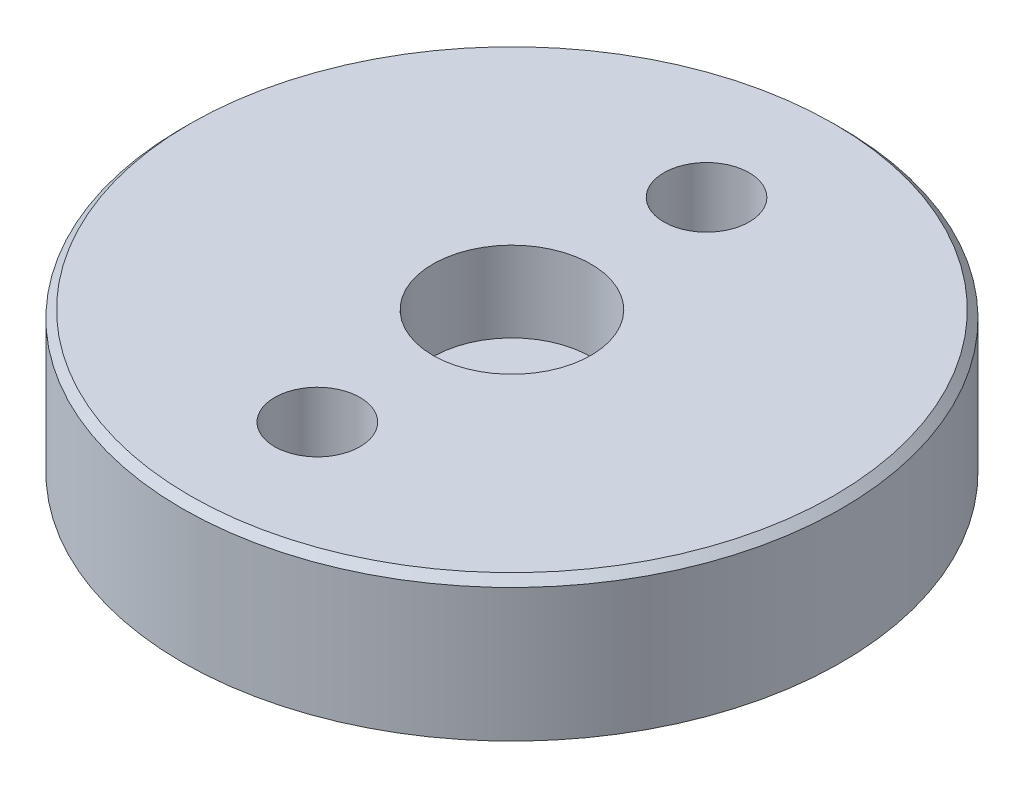
ISO-10303-21;
HEADER;
FILE_DESCRIPTION(('STEP AP214'),'2;1');
FILE_NAME('part.step','',(''),(''),'','','');
FILE_SCHEMA(('AUTOMOTIVE_DESIGN { 1 0 10303 214 1 1 1 1 }'));
ENDSEC;
DATA;
#1=APPLICATION_CONTEXT('core data for automotive mechanical design processes');
#2=APPLICATION_PROTOCOL_DEFINITION('international standard','automotive_design',2000,#1);
#3=PRODUCT_CONTEXT('',#1,'mechanical');
#4=PRODUCT('Part','Part','',(#3));
#5=PRODUCT_RELATED_PRODUCT_CATEGORY('part','',(#4));
#6=PRODUCT_DEFINITION_FORMATION('','',#4);
#7=PRODUCT_DEFINITION_CONTEXT('part definition',#1,'design');
#8=PRODUCT_DEFINITION('design','',#6,#7);
#9=PRODUCT_DEFINITION_SHAPE('','',#8);
#10=(LENGTH_UNIT() NAMED_UNIT(*) SI_UNIT(.MILLI.,.METRE.));
#11=(NAMED_UNIT(*) PLANE_ANGLE_UNIT() SI_UNIT($,.RADIAN.));
#12=(NAMED_UNIT(*) SI_UNIT($,.STERADIAN.) SOLID_ANGLE_UNIT());
#13=UNCERTAINTY_MEASURE_WITH_UNIT(LENGTH_MEASURE(1.E-05),#10,'distance_accuracy_value','');
#14=(GEOMETRIC_REPRESENTATION_CONTEXT(3) GLOBAL_UNCERTAINTY_ASSIGNED_CONTEXT((#13)) GLOBAL_UNIT_ASSIGNED_CONTEXT((#10,
#11,#12)) REPRESENTATION_CONTEXT('',''));
#15=CARTESIAN_POINT('',(0.,0.,0.));
#16=DIRECTION('',(0.,0.,1.));
#17=DIRECTION('',(1.,0.,0.));
#18=AXIS2_PLACEMENT_3D('',#15,#16,#17);
#19=CARTESIAN_POINT('',(0.,-468.875483874394,0.));
#20=DIRECTION('',(0.,1.,0.));
#21=DIRECTION('',(0.,0.,1.));
#22=AXIS2_PLACEMENT_3D('',#19,#20,#21);
#23=CYLINDRICAL_SURFACE('',#22,13.125);
#24=CARTESIAN_POINT('',(0.,-463.575483874394,0.));
#25=DIRECTION('',(0.,1.,0.));
#26=DIRECTION('',(0.,0.,1.));
#27=AXIS2_PLACEMENT_3D('',#24,#25,#26);
#28=CIRCLE('',#27,13.125);
#29=CARTESIAN_POINT('',(0.,-463.575483874394,13.125));
#30=VERTEX_POINT('',#29);
#31=EDGE_CURVE('E10',#30,#30,#28,.F.);
#32=ORIENTED_EDGE('',*,*,#31,.T.);
#33=EDGE_LOOP('',(#32));
#34=FACE_BOUND('',#33,.T.);
#35=CARTESIAN_POINT('',(0.,-468.875483874394,0.));
#36=DIRECTION('',(0.,1.,0.));
#37=DIRECTION('',(0.,0.,1.));
#38=AXIS2_PLACEMENT_3D('',#35,#36,#37);
#39=CIRCLE('',#38,13.125);
#40=CARTESIAN_POINT('',(0.,-468.875483874394,13.125));
#41=VERTEX_POINT('',#40);
#42=EDGE_CURVE('E53',#41,#41,#39,.T.);
#43=ORIENTED_EDGE('',*,*,#42,.T.);
#44=EDGE_LOOP('',(#43));
#45=FACE_BOUND('',#44,.T.);
#46=ADVANCED_FACE('F39',(#34,#45),#23,.T.);
#47=CARTESIAN_POINT('',(0.,-468.875483874394,0.));
#48=DIRECTION('',(0.,1.,0.));
#49=DIRECTION('',(0.,0.,1.));
#50=AXIS2_PLACEMENT_3D('',#47,#48,#49);
#51=PLANE('',#50);
#52=CARTESIAN_POINT('',(0.,-468.875483874394,0.));
#53=DIRECTION('',(0.,-1.,0.));
#54=DIRECTION('',(0.,0.,-1.));
#55=AXIS2_PLACEMENT_3D('',#52,#53,#54);
#56=CIRCLE('',#55,11.125);
#57=CARTESIAN_POINT('',(0.,-468.875483874394,-11.125));
#58=VERTEX_POINT('',#57);
#59=EDGE_CURVE('E74',#58,#58,#56,.T.);
#60=ORIENTED_EDGE('',*,*,#59,.F.);
#61=EDGE_LOOP('',(#60));
#62=FACE_BOUND('',#61,.T.);
#63=ORIENTED_EDGE('',*,*,#42,.F.);
#64=EDGE_LOOP('',(#63));
#65=FACE_BOUND('',#64,.T.);
#66=ADVANCED_FACE('F85',(#62,#65),#51,.F.);
#67=CARTESIAN_POINT('',(0.,-463.275483874394,0.));
#68=DIRECTION('',(0.,1.,0.));
#69=DIRECTION('',(0.,0.,1.));
#70=AXIS2_PLACEMENT_3D('',#67,#68,#69);
#71=PLANE('',#70);
#72=CARTESIAN_POINT('',(0.,-463.275483874394,7.75));
#73=DIRECTION('',(0.,1.,0.));
#74=DIRECTION('',(0.,0.,1.));
#75=AXIS2_PLACEMENT_3D('',#72,#73,#74);
#76=CIRCLE('',#75,1.7);
#77=CARTESIAN_POINT('',(0.,-463.275483874394,9.45));
#78=VERTEX_POINT('',#77);
#79=EDGE_CURVE('E58',#78,#78,#76,.T.);
#80=ORIENTED_EDGE('',*,*,#79,.F.);
#81=EDGE_LOOP('',(#80));
#82=FACE_BOUND('',#81,.T.);
#83=CARTESIAN_POINT('',(0.,-463.275483874394,-7.75));
#84=DIRECTION('',(0.,1.,0.));
#85=DIRECTION('',(0.,0.,-1.));
#86=AXIS2_PLACEMENT_3D('',#83,#84,#85);
#87=CIRCLE('',#86,1.7);
#88=CARTESIAN_POINT('',(0.,-463.275483874394,-6.05));
#89=VERTEX_POINT('',#88);
#90=EDGE_CURVE('E64',#89,#89,#87,.T.);
#91=ORIENTED_EDGE('',*,*,#90,.F.);
#92=EDGE_LOOP('',(#91));
#93=FACE_BOUND('',#92,.T.);
#94=CARTESIAN_POINT('',(0.,-463.275483874394,0.));
#95=DIRECTION('',(0.,1.,0.));
#96=DIRECTION('',(0.,0.,1.));
#97=AXIS2_PLACEMENT_3D('',#94,#95,#96);
#98=CIRCLE('',#97,12.825);
#99=CARTESIAN_POINT('',(0.,-463.275483874394,12.825));
#100=VERTEX_POINT('',#99);
#101=EDGE_CURVE('E48',#100,#100,#98,.T.);
#102=ORIENTED_EDGE('',*,*,#101,.T.);
#103=EDGE_LOOP('',(#102));
#104=FACE_BOUND('',#103,.T.);
#105=CARTESIAN_POINT('',(0.,-463.275483874394,0.));
#106=DIRECTION('',(0.,1.,0.));
#107=DIRECTION('',(0.,0.,1.));
#108=AXIS2_PLACEMENT_3D('',#105,#106,#107);
#109=CIRCLE('',#108,3.15);
#110=CARTESIAN_POINT('',(0.,-463.275483874394,3.15));
#111=VERTEX_POINT('',#110);
#112=EDGE_CURVE('E62',#111,#111,#109,.T.);
#113=ORIENTED_EDGE('',*,*,#112,.F.);
#114=EDGE_LOOP('',(#113));
#115=FACE_BOUND('',#114,.T.);
#116=ADVANCED_FACE('F87',(#82,#93,#104,#115),#71,.T.);
#117=CARTESIAN_POINT('',(0.,-467.875483874394,0.));
#118=DIRECTION('',(0.,-1.,0.));
#119=DIRECTION('',(0.,0.,-1.));
#120=AXIS2_PLACEMENT_3D('',#117,#118,#119);
#121=CYLINDRICAL_SURFACE('',#120,11.125);
#122=CARTESIAN_POINT('',(0.,-467.875483874394,0.));
#123=DIRECTION('',(0.,-1.,0.));
#124=DIRECTION('',(0.,0.,-1.));
#125=AXIS2_PLACEMENT_3D('',#122,#123,#124);
#126=CIRCLE('',#125,11.125);
#127=CARTESIAN_POINT('',(0.,-467.875483874394,-11.125));
#128=VERTEX_POINT('',#127);
#129=EDGE_CURVE('E77',#128,#128,#126,.T.);
#130=ORIENTED_EDGE('',*,*,#129,.F.);
#131=EDGE_LOOP('',(#130));
#132=FACE_BOUND('',#131,.T.);
#133=ORIENTED_EDGE('',*,*,#59,.T.);
#134=EDGE_LOOP('',(#133));
#135=FACE_BOUND('',#134,.T.);
#136=ADVANCED_FACE('F94',(#132,#135),#121,.F.);
#137=CARTESIAN_POINT('',(0.,-467.875483874394,0.));
#138=DIRECTION('',(0.,-1.,0.));
#139=DIRECTION('',(0.,0.,-1.));
#140=AXIS2_PLACEMENT_3D('',#137,#138,#139);
#141=PLANE('',#140);
#142=CARTESIAN_POINT('',(0.,-467.875483874394,7.75));
#143=DIRECTION('',(0.,-1.,0.));
#144=DIRECTION('',(0.,0.,-1.));
#145=AXIS2_PLACEMENT_3D('',#142,#143,#144);
#146=CIRCLE('',#145,1.7);
#147=CARTESIAN_POINT('',(0.,-467.875483874394,9.45));
#148=VERTEX_POINT('',#147);
#149=EDGE_CURVE('E44',#148,#148,#146,.T.);
#150=ORIENTED_EDGE('',*,*,#149,.F.);
#151=EDGE_LOOP('',(#150));
#152=FACE_BOUND('',#151,.T.);
#153=CARTESIAN_POINT('',(0.,-467.875483874394,-7.75));
#154=DIRECTION('',(0.,-1.,0.));
#155=DIRECTION('',(0.,0.,-1.));
#156=AXIS2_PLACEMENT_3D('',#153,#154,#155);
#157=CIRCLE('',#156,1.7);
#158=CARTESIAN_POINT('',(0.,-467.875483874394,-6.05));
#159=VERTEX_POINT('',#158);
#160=EDGE_CURVE('E56',#159,#159,#157,.T.);
#161=ORIENTED_EDGE('',*,*,#160,.F.);
#162=EDGE_LOOP('',(#161));
#163=FACE_BOUND('',#162,.T.);
#164=ORIENTED_EDGE('',*,*,#129,.T.);
#165=EDGE_LOOP('',(#164));
#166=FACE_BOUND('',#165,.T.);
#167=ADVANCED_FACE('F101',(#152,#163,#166),#141,.T.);
#168=CARTESIAN_POINT('',(0.,-466.475483874394,0.));
#169=DIRECTION('',(0.,1.,0.));
#170=DIRECTION('',(0.,0.,1.));
#171=AXIS2_PLACEMENT_3D('',#168,#169,#170);
#172=CYLINDRICAL_SURFACE('',#171,3.15);
#173=CARTESIAN_POINT('',(0.,-466.475483874394,0.));
#174=DIRECTION('',(0.,1.,0.));
#175=DIRECTION('',(0.,0.,1.));
#176=AXIS2_PLACEMENT_3D('',#173,#174,#175);
#177=CIRCLE('',#176,3.15);
#178=CARTESIAN_POINT('',(0.,-466.475483874394,3.15));
#179=VERTEX_POINT('',#178);
#180=EDGE_CURVE('E71',#179,#179,#177,.T.);
#181=ORIENTED_EDGE('',*,*,#180,.F.);
#182=EDGE_LOOP('',(#181));
#183=FACE_BOUND('',#182,.T.);
#184=ORIENTED_EDGE('',*,*,#112,.T.);
#185=EDGE_LOOP('',(#184));
#186=FACE_BOUND('',#185,.T.);
#187=ADVANCED_FACE('F105',(#183,#186),#172,.F.);
#188=CARTESIAN_POINT('',(0.,-466.475483874394,0.));
#189=DIRECTION('',(0.,1.,0.));
#190=DIRECTION('',(0.,0.,1.));
#191=AXIS2_PLACEMENT_3D('',#188,#189,#190);
#192=PLANE('',#191);
#193=ORIENTED_EDGE('',*,*,#180,.T.);
#194=EDGE_LOOP('',(#193));
#195=FACE_BOUND('',#194,.T.);
#196=ADVANCED_FACE('F109',(#195),#192,.T.);
#197=CARTESIAN_POINT('',(0.,-463.275483874394,0.));
#198=DIRECTION('',(0.,-1.,0.));
#199=DIRECTION('',(0.,0.,-1.));
#200=AXIS2_PLACEMENT_3D('',#197,#198,#199);
#201=CONICAL_SURFACE('',#200,12.825,0.785398163397468);
#202=ORIENTED_EDGE('',*,*,#31,.F.);
#203=EDGE_LOOP('',(#202));
#204=FACE_BOUND('',#203,.T.);
#205=ORIENTED_EDGE('',*,*,#101,.F.);
#206=EDGE_LOOP('',(#205));
#207=FACE_BOUND('',#206,.T.);
#208=ADVANCED_FACE('F42',(#204,#207),#201,.T.);
#209=CARTESIAN_POINT('',(0.,-468.875483874394,-7.75));
#210=DIRECTION('',(0.,1.,0.));
#211=DIRECTION('',(0.,0.,1.));
#212=AXIS2_PLACEMENT_3D('',#209,#210,#211);
#213=CYLINDRICAL_SURFACE('',#212,1.7);
#214=CARTESIAN_POINT('',(0.,-467.875483874394,-6.05));
#215=CARTESIAN_POINT('',(0.,-467.827567207727,-6.05));
#216=CARTESIAN_POINT('',(0.,-467.779650541061,-6.05));
#217=CARTESIAN_POINT('',(0.,-467.683817207727,-6.05));
#218=CARTESIAN_POINT('',(0.,-467.635900541061,-6.05));
#219=CARTESIAN_POINT('',(0.,-467.540067207727,-6.05));
#220=CARTESIAN_POINT('',(0.,-467.492150541061,-6.05));
#221=CARTESIAN_POINT('',(0.,-467.396317207727,-6.05));
#222=CARTESIAN_POINT('',(0.,-467.348400541061,-6.05));
#223=CARTESIAN_POINT('',(0.,-467.252567207727,-6.05));
#224=CARTESIAN_POINT('',(0.,-467.204650541061,-6.05));
#225=CARTESIAN_POINT('',(0.,-467.108817207727,-6.05));
#226=CARTESIAN_POINT('',(0.,-467.060900541061,-6.05));
#227=CARTESIAN_POINT('',(0.,-466.965067207727,-6.05));
#228=CARTESIAN_POINT('',(0.,-466.917150541061,-6.05));
#229=CARTESIAN_POINT('',(0.,-466.821317207727,-6.05));
#230=CARTESIAN_POINT('',(0.,-466.773400541061,-6.05));
#231=CARTESIAN_POINT('',(0.,-466.677567207727,-6.05));
#232=CARTESIAN_POINT('',(0.,-466.629650541061,-6.05));
#233=CARTESIAN_POINT('',(0.,-466.533817207727,-6.05));
#234=CARTESIAN_POINT('',(0.,-466.485900541061,-6.05));
#235=CARTESIAN_POINT('',(0.,-466.390067207727,-6.05));
#236=CARTESIAN_POINT('',(0.,-466.342150541061,-6.05));
#237=CARTESIAN_POINT('',(0.,-466.246317207727,-6.05));
#238=CARTESIAN_POINT('',(0.,-466.198400541061,-6.05));
#239=CARTESIAN_POINT('',(0.,-466.102567207727,-6.05));
#240=CARTESIAN_POINT('',(0.,-466.054650541061,-6.05));
#241=CARTESIAN_POINT('',(0.,-465.958817207727,-6.05));
#242=CARTESIAN_POINT('',(0.,-465.910900541061,-6.05));
#243=CARTESIAN_POINT('',(0.,-465.815067207727,-6.05));
#244=CARTESIAN_POINT('',(0.,-465.767150541061,-6.05));
#245=CARTESIAN_POINT('',(0.,-465.671317207727,-6.05));
#246=CARTESIAN_POINT('',(0.,-465.623400541061,-6.05));
#247=CARTESIAN_POINT('',(0.,-465.527567207727,-6.05));
#248=CARTESIAN_POINT('',(0.,-465.479650541061,-6.05));
#249=CARTESIAN_POINT('',(0.,-465.383817207727,-6.05));
#250=CARTESIAN_POINT('',(0.,-465.335900541061,-6.05));
#251=CARTESIAN_POINT('',(0.,-465.240067207727,-6.05));
#252=CARTESIAN_POINT('',(0.,-465.192150541061,-6.05));
#253=CARTESIAN_POINT('',(0.,-465.096317207728,-6.05));
#254=CARTESIAN_POINT('',(0.,-465.048400541061,-6.05));
#255=CARTESIAN_POINT('',(0.,-464.952567207727,-6.05));
#256=CARTESIAN_POINT('',(0.,-464.904650541061,-6.05));
#257=CARTESIAN_POINT('',(0.,-464.808817207727,-6.05));
#258=CARTESIAN_POINT('',(0.,-464.760900541061,-6.05));
#259=CARTESIAN_POINT('',(0.,-464.665067207727,-6.05));
#260=CARTESIAN_POINT('',(0.,-464.617150541061,-6.05));
#261=CARTESIAN_POINT('',(0.,-464.521317207727,-6.05));
#262=CARTESIAN_POINT('',(0.,-464.473400541061,-6.05));
#263=CARTESIAN_POINT('',(0.,-464.377567207728,-6.05));
#264=CARTESIAN_POINT('',(0.,-464.329650541061,-6.05));
#265=CARTESIAN_POINT('',(0.,-464.233817207727,-6.05));
#266=CARTESIAN_POINT('',(0.,-464.185900541061,-6.05));
#267=CARTESIAN_POINT('',(0.,-464.090067207727,-6.05));
#268=CARTESIAN_POINT('',(0.,-464.042150541061,-6.05));
#269=CARTESIAN_POINT('',(0.,-463.946317207727,-6.05));
#270=CARTESIAN_POINT('',(0.,-463.898400541061,-6.05));
#271=CARTESIAN_POINT('',(0.,-463.802567207728,-6.05));
#272=CARTESIAN_POINT('',(0.,-463.754650541061,-6.05));
#273=CARTESIAN_POINT('',(0.,-463.658817207728,-6.05));
#274=CARTESIAN_POINT('',(0.,-463.610900541061,-6.05));
#275=CARTESIAN_POINT('',(0.,-463.515067207727,-6.05));
#276=CARTESIAN_POINT('',(0.,-463.467150541061,-6.05));
#277=CARTESIAN_POINT('',(0.,-463.371317207727,-6.05));
#278=CARTESIAN_POINT('',(0.,-463.323400541061,-6.05));
#279=CARTESIAN_POINT('',(0.,-463.275483874394,-6.05));
#280=B_SPLINE_CURVE_WITH_KNOTS('',3,(#214,#215,#216,#217,#218,#219,#220,#221,#222,#223,#224,
#225,#226,#227,#228,#229,#230,#231,#232,#233,#234,#235,#236,#237,#238,#239,#240,#241,#242,#243,
#244,#245,#246,#247,#248,#249,#250,#251,#252,#253,#254,#255,#256,#257,#258,#259,#260,#261,#262,
#263,#264,#265,#266,#267,#268,#269,#270,#271,#272,#273,#274,#275,#276,#277,#278,#279),
.UNSPECIFIED.,.F.,.F.,(4,2,2,2,2,2,2,2,2,2,2,2,2,2,2,2,2,2,2,2,2,2,2,2,2,2,2,2,2,2,2,2,4),(0.,
0.143749999999998,0.287499999999996,0.431249999999994,0.574999999999992,0.71874999999999,
0.862499999999988,1.00624999999999,1.14999999999998,1.29374999999998,1.43749999999998,
1.58124999999998,1.72499999999998,1.86874999999997,2.01249999999997,2.15624999999997,
2.29999999999997,2.44374999999997,2.58749999999996,2.73124999999996,2.87499999999996,
3.01874999999996,3.16249999999996,3.30624999999996,3.44999999999995,3.59374999999995,
3.73749999999995,3.88124999999995,4.02499999999995,4.16874999999994,4.31249999999994,
4.45624999999994,4.59999999999994),.UNSPECIFIED.);
#281=EDGE_CURVE('BSEAM114',#159,#89,#280,.T.);
#282=ORIENTED_EDGE('',*,*,#160,.T.);
#283=ORIENTED_EDGE('',*,*,#90,.T.);
#284=ORIENTED_EDGE('',*,*,#281,.T.);
#285=ORIENTED_EDGE('',*,*,#281,.F.);
#286=EDGE_LOOP('',(#282,#284,#283,#285));
#287=FACE_BOUND('',#286,.T.);
#288=ADVANCED_FACE('F114',(#287),#213,.F.);
#289=CARTESIAN_POINT('',(0.,-468.875483874394,7.75));
#290=DIRECTION('',(0.,1.,0.));
#291=DIRECTION('',(0.,0.,1.));
#292=AXIS2_PLACEMENT_3D('',#289,#290,#291);
#293=CYLINDRICAL_SURFACE('',#292,1.7);
#294=CARTESIAN_POINT('',(0.,-467.875483874394,9.45));
#295=CARTESIAN_POINT('',(0.,-467.827567207727,9.45));
#296=CARTESIAN_POINT('',(0.,-467.779650541061,9.45));
#297=CARTESIAN_POINT('',(0.,-467.683817207727,9.45));
#298=CARTESIAN_POINT('',(0.,-467.635900541061,9.45));
#299=CARTESIAN_POINT('',(0.,-467.540067207727,9.45));
#300=CARTESIAN_POINT('',(0.,-467.492150541061,9.45));
#301=CARTESIAN_POINT('',(0.,-467.396317207727,9.45));
#302=CARTESIAN_POINT('',(0.,-467.348400541061,9.45));
#303=CARTESIAN_POINT('',(0.,-467.252567207727,9.45));
#304=CARTESIAN_POINT('',(0.,-467.204650541061,9.45));
#305=CARTESIAN_POINT('',(0.,-467.108817207727,9.45));
#306=CARTESIAN_POINT('',(0.,-467.060900541061,9.45));
#307=CARTESIAN_POINT('',(0.,-466.965067207727,9.45));
#308=CARTESIAN_POINT('',(0.,-466.917150541061,9.45));
#309=CARTESIAN_POINT('',(0.,-466.821317207727,9.45));
#310=CARTESIAN_POINT('',(0.,-466.773400541061,9.45));
#311=CARTESIAN_POINT('',(0.,-466.677567207727,9.45));
#312=CARTESIAN_POINT('',(0.,-466.629650541061,9.45));
#313=CARTESIAN_POINT('',(0.,-466.533817207727,9.45));
#314=CARTESIAN_POINT('',(0.,-466.485900541061,9.45));
#315=CARTESIAN_POINT('',(0.,-466.390067207727,9.45));
#316=CARTESIAN_POINT('',(0.,-466.342150541061,9.45));
#317=CARTESIAN_POINT('',(0.,-466.246317207727,9.45));
#318=CARTESIAN_POINT('',(0.,-466.198400541061,9.45));
#319=CARTESIAN_POINT('',(0.,-466.102567207727,9.45));
#320=CARTESIAN_POINT('',(0.,-466.054650541061,9.45));
#321=CARTESIAN_POINT('',(0.,-465.958817207727,9.45));
#322=CARTESIAN_POINT('',(0.,-465.910900541061,9.45));
#323=CARTESIAN_POINT('',(0.,-465.815067207727,9.45));
#324=CARTESIAN_POINT('',(0.,-465.767150541061,9.45));
#325=CARTESIAN_POINT('',(0.,-465.671317207727,9.45));
#326=CARTESIAN_POINT('',(0.,-465.623400541061,9.45));
#327=CARTESIAN_POINT('',(0.,-465.527567207727,9.45));
#328=CARTESIAN_POINT('',(0.,-465.479650541061,9.45));
#329=CARTESIAN_POINT('',(0.,-465.383817207727,9.45));
#330=CARTESIAN_POINT('',(0.,-465.335900541061,9.45));
#331=CARTESIAN_POINT('',(0.,-465.240067207727,9.45));
#332=CARTESIAN_POINT('',(0.,-465.192150541061,9.45));
#333=CARTESIAN_POINT('',(0.,-465.096317207728,9.45));
#334=CARTESIAN_POINT('',(0.,-465.048400541061,9.45));
#335=CARTESIAN_POINT('',(0.,-464.952567207727,9.45));
#336=CARTESIAN_POINT('',(0.,-464.904650541061,9.45));
#337=CARTESIAN_POINT('',(0.,-464.808817207727,9.45));
#338=CARTESIAN_POINT('',(0.,-464.760900541061,9.45));
#339=CARTESIAN_POINT('',(0.,-464.665067207727,9.45));
#340=CARTESIAN_POINT('',(0.,-464.617150541061,9.45));
#341=CARTESIAN_POINT('',(0.,-464.521317207727,9.45));
#342=CARTESIAN_POINT('',(0.,-464.473400541061,9.45));
#343=CARTESIAN_POINT('',(0.,-464.377567207728,9.45));
#344=CARTESIAN_POINT('',(0.,-464.329650541061,9.45));
#345=CARTESIAN_POINT('',(0.,-464.233817207727,9.45));
#346=CARTESIAN_POINT('',(0.,-464.185900541061,9.45));
#347=CARTESIAN_POINT('',(0.,-464.090067207727,9.45));
#348=CARTESIAN_POINT('',(0.,-464.042150541061,9.45));
#349=CARTESIAN_POINT('',(0.,-463.946317207727,9.45));
#350=CARTESIAN_POINT('',(0.,-463.898400541061,9.45));
#351=CARTESIAN_POINT('',(0.,-463.802567207728,9.45));
#352=CARTESIAN_POINT('',(0.,-463.754650541061,9.45));
#353=CARTESIAN_POINT('',(0.,-463.658817207728,9.45));
#354=CARTESIAN_POINT('',(0.,-463.610900541061,9.45));
#355=CARTESIAN_POINT('',(0.,-463.515067207727,9.45));
#356=CARTESIAN_POINT('',(0.,-463.467150541061,9.45));
#357=CARTESIAN_POINT('',(0.,-463.371317207727,9.45));
#358=CARTESIAN_POINT('',(0.,-463.323400541061,9.45));
#359=CARTESIAN_POINT('',(0.,-463.275483874394,9.45));
#360=B_SPLINE_CURVE_WITH_KNOTS('',3,(#294,#295,#296,#297,#298,#299,#300,#301,#302,#303,#304,
#305,#306,#307,#308,#309,#310,#311,#312,#313,#314,#315,#316,#317,#318,#319,#320,#321,#322,#323,
#324,#325,#326,#327,#328,#329,#330,#331,#332,#333,#334,#335,#336,#337,#338,#339,#340,#341,#342,
#343,#344,#345,#346,#347,#348,#349,#350,#351,#352,#353,#354,#355,#356,#357,#358,#359),
.UNSPECIFIED.,.F.,.F.,(4,2,2,2,2,2,2,2,2,2,2,2,2,2,2,2,2,2,2,2,2,2,2,2,2,2,2,2,2,2,2,2,4),(0.,
0.143749999999998,0.287499999999996,0.431249999999994,0.574999999999992,0.71874999999999,
0.862499999999988,1.00624999999999,1.14999999999998,1.29374999999998,1.43749999999998,
1.58124999999998,1.72499999999998,1.86874999999997,2.01249999999997,2.15624999999997,
2.29999999999997,2.44374999999997,2.58749999999996,2.73124999999996,2.87499999999996,
3.01874999999996,3.16249999999996,3.30624999999996,3.44999999999995,3.59374999999995,
3.73749999999995,3.88124999999995,4.02499999999995,4.16874999999994,4.31249999999994,
4.45624999999994,4.59999999999994),.UNSPECIFIED.);
#361=EDGE_CURVE('BSEAM117',#148,#78,#360,.T.);
#362=ORIENTED_EDGE('',*,*,#149,.T.);
#363=ORIENTED_EDGE('',*,*,#79,.T.);
#364=ORIENTED_EDGE('',*,*,#361,.T.);
#365=ORIENTED_EDGE('',*,*,#361,.F.);
#366=EDGE_LOOP('',(#362,#364,#363,#365));
#367=FACE_BOUND('',#366,.T.);
#368=ADVANCED_FACE('F117',(#367),#293,.F.);
#369=CLOSED_SHELL('',(#46,#66,#116,#136,#167,#187,#196,#208,#288,#368));
#370=MANIFOLD_SOLID_BREP('B2',#369);
#371=ADVANCED_BREP_SHAPE_REPRESENTATION('',(#18,#370),#14);
#372=SHAPE_DEFINITION_REPRESENTATION(#9,#371);
ENDSEC;
END-ISO-10303-21;
